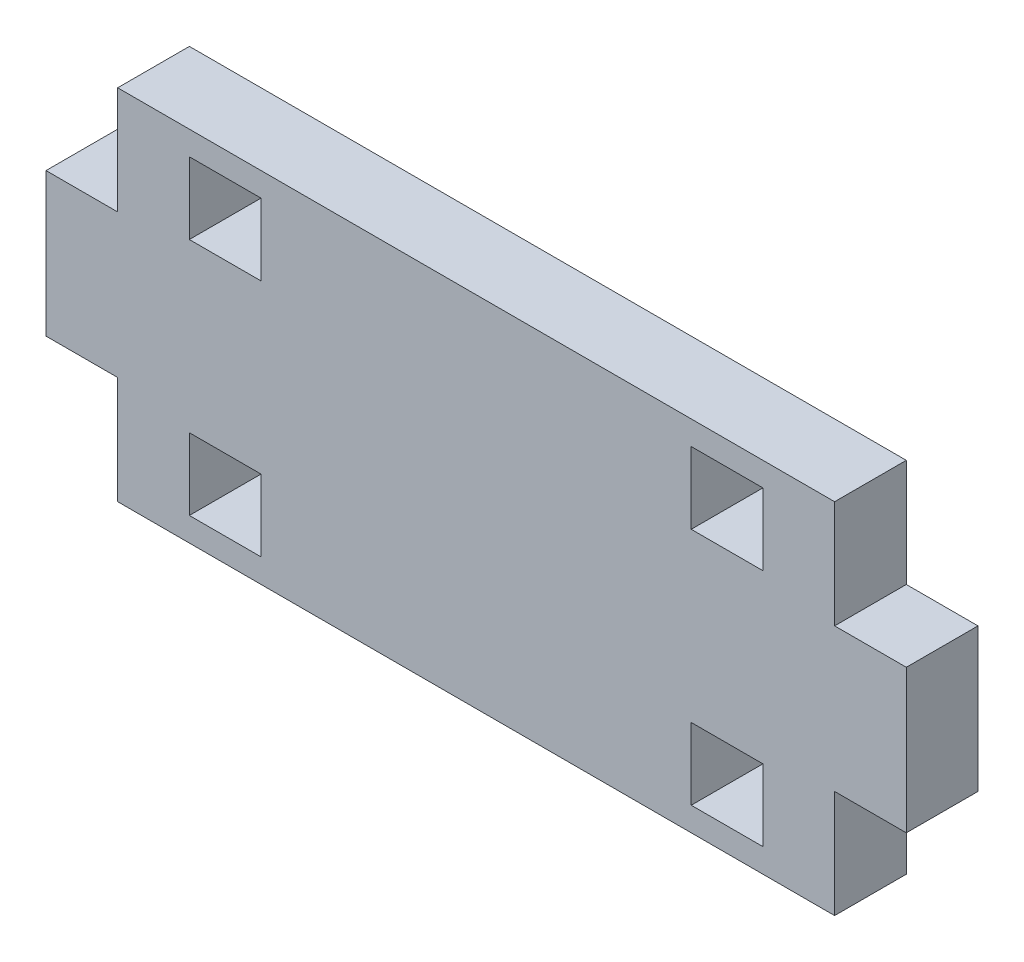
ISO-10303-21;
HEADER;
FILE_DESCRIPTION(('STEP AP214'),'2;1');
FILE_NAME('part.step','',(''),(''),'','','');
FILE_SCHEMA(('AUTOMOTIVE_DESIGN { 1 0 10303 214 1 1 1 1 }'));
ENDSEC;
DATA;
#1=APPLICATION_CONTEXT('core data for automotive mechanical design processes');
#2=APPLICATION_PROTOCOL_DEFINITION('international standard','automotive_design',2000,#1);
#3=PRODUCT_CONTEXT('',#1,'mechanical');
#4=PRODUCT('Part','Part','',(#3));
#5=PRODUCT_RELATED_PRODUCT_CATEGORY('part','',(#4));
#6=PRODUCT_DEFINITION_FORMATION('','',#4);
#7=PRODUCT_DEFINITION_CONTEXT('part definition',#1,'design');
#8=PRODUCT_DEFINITION('design','',#6,#7);
#9=PRODUCT_DEFINITION_SHAPE('','',#8);
#10=(LENGTH_UNIT() NAMED_UNIT(*) SI_UNIT(.MILLI.,.METRE.));
#11=(NAMED_UNIT(*) PLANE_ANGLE_UNIT() SI_UNIT($,.RADIAN.));
#12=(NAMED_UNIT(*) SI_UNIT($,.STERADIAN.) SOLID_ANGLE_UNIT());
#13=UNCERTAINTY_MEASURE_WITH_UNIT(LENGTH_MEASURE(1.E-05),#10,'distance_accuracy_value','');
#14=(GEOMETRIC_REPRESENTATION_CONTEXT(3) GLOBAL_UNCERTAINTY_ASSIGNED_CONTEXT((#13)) GLOBAL_UNIT_ASSIGNED_CONTEXT((#10,
#11,#12)) REPRESENTATION_CONTEXT('',''));
#15=CARTESIAN_POINT('',(0.,0.,0.));
#16=DIRECTION('',(0.,0.,1.));
#17=DIRECTION('',(1.,0.,0.));
#18=AXIS2_PLACEMENT_3D('',#15,#16,#17);
#19=CARTESIAN_POINT('',(0.,0.,3.));
#20=DIRECTION('',(0.,0.,1.));
#21=DIRECTION('',(1.,0.,0.));
#22=AXIS2_PLACEMENT_3D('',#19,#20,#21);
#23=PLANE('',#22);
#24=DIRECTION('',(0.,-1.,0.));
#25=VECTOR('',#24,1.);
#26=CARTESIAN_POINT('',(-16.,3.4986125801518,3.));
#27=LINE('',#26,#25);
#28=CARTESIAN_POINT('',(-16.,3.4986125801518,3.));
#29=VERTEX_POINT('',#28);
#30=CARTESIAN_POINT('',(-16.,-2.5013874198482,3.));
#31=VERTEX_POINT('',#30);
#32=EDGE_CURVE('E347',#29,#31,#27,.T.);
#33=ORIENTED_EDGE('',*,*,#32,.T.);
#34=DIRECTION('',(1.,0.,0.));
#35=VECTOR('',#34,1.);
#36=CARTESIAN_POINT('',(-16.,-2.5013874198482,3.));
#37=LINE('',#36,#35);
#38=CARTESIAN_POINT('',(-13.,-2.5013874198482,3.));
#39=VERTEX_POINT('',#38);
#40=EDGE_CURVE('E350',#31,#39,#37,.T.);
#41=ORIENTED_EDGE('',*,*,#40,.T.);
#42=DIRECTION('',(0.,-1.,0.));
#43=VECTOR('',#42,1.);
#44=CARTESIAN_POINT('',(-13.,-2.5013874198482,3.));
#45=LINE('',#44,#43);
#46=CARTESIAN_POINT('',(-13.,-7.0013874198482,3.));
#47=VERTEX_POINT('',#46);
#48=EDGE_CURVE('E353',#39,#47,#45,.T.);
#49=ORIENTED_EDGE('',*,*,#48,.T.);
#50=DIRECTION('',(1.,0.,0.));
#51=VECTOR('',#50,1.);
#52=CARTESIAN_POINT('',(-13.,-7.0013874198482,3.));
#53=LINE('',#52,#51);
#54=CARTESIAN_POINT('',(17.,-7.0013874198482,3.));
#55=VERTEX_POINT('',#54);
#56=EDGE_CURVE('E355',#47,#55,#53,.T.);
#57=ORIENTED_EDGE('',*,*,#56,.T.);
#58=DIRECTION('',(0.,1.,0.));
#59=VECTOR('',#58,1.);
#60=CARTESIAN_POINT('',(17.,-2.5013874198482,3.));
#61=LINE('',#60,#59);
#62=CARTESIAN_POINT('',(17.,-2.5013874198482,3.));
#63=VERTEX_POINT('',#62);
#64=EDGE_CURVE('E357',#55,#63,#61,.T.);
#65=ORIENTED_EDGE('',*,*,#64,.T.);
#66=DIRECTION('',(1.,0.,0.));
#67=VECTOR('',#66,1.);
#68=CARTESIAN_POINT('',(20.,-2.5013874198482,3.));
#69=LINE('',#68,#67);
#70=CARTESIAN_POINT('',(20.,-2.5013874198482,3.));
#71=VERTEX_POINT('',#70);
#72=EDGE_CURVE('E359',#63,#71,#69,.T.);
#73=ORIENTED_EDGE('',*,*,#72,.T.);
#74=DIRECTION('',(0.,1.,0.));
#75=VECTOR('',#74,1.);
#76=CARTESIAN_POINT('',(20.,3.4986125801518,3.));
#77=LINE('',#76,#75);
#78=CARTESIAN_POINT('',(20.,3.4986125801518,3.));
#79=VERTEX_POINT('',#78);
#80=EDGE_CURVE('E361',#71,#79,#77,.T.);
#81=ORIENTED_EDGE('',*,*,#80,.T.);
#82=DIRECTION('',(-1.,0.,0.));
#83=VECTOR('',#82,1.);
#84=CARTESIAN_POINT('',(17.,3.4986125801518,3.));
#85=LINE('',#84,#83);
#86=CARTESIAN_POINT('',(17.,3.4986125801518,3.));
#87=VERTEX_POINT('',#86);
#88=EDGE_CURVE('E363',#79,#87,#85,.T.);
#89=ORIENTED_EDGE('',*,*,#88,.T.);
#90=DIRECTION('',(0.,1.,0.));
#91=VECTOR('',#90,1.);
#92=CARTESIAN_POINT('',(17.,7.9986125801518,3.));
#93=LINE('',#92,#91);
#94=CARTESIAN_POINT('',(17.,7.9986125801518,3.));
#95=VERTEX_POINT('',#94);
#96=EDGE_CURVE('E365',#87,#95,#93,.T.);
#97=ORIENTED_EDGE('',*,*,#96,.T.);
#98=DIRECTION('',(-1.,0.,0.));
#99=VECTOR('',#98,1.);
#100=CARTESIAN_POINT('',(-13.,7.9986125801518,3.));
#101=LINE('',#100,#99);
#102=CARTESIAN_POINT('',(-13.,7.9986125801518,3.));
#103=VERTEX_POINT('',#102);
#104=EDGE_CURVE('E367',#95,#103,#101,.T.);
#105=ORIENTED_EDGE('',*,*,#104,.T.);
#106=DIRECTION('',(0.,-1.,0.));
#107=VECTOR('',#106,1.);
#108=CARTESIAN_POINT('',(-13.,3.4986125801518,3.));
#109=LINE('',#108,#107);
#110=CARTESIAN_POINT('',(-13.,3.4986125801518,3.));
#111=VERTEX_POINT('',#110);
#112=EDGE_CURVE('E369',#103,#111,#109,.T.);
#113=ORIENTED_EDGE('',*,*,#112,.T.);
#114=DIRECTION('',(-1.,0.,0.));
#115=VECTOR('',#114,1.);
#116=CARTESIAN_POINT('',(-16.,3.4986125801518,3.));
#117=LINE('',#116,#115);
#118=EDGE_CURVE('E371',#111,#29,#117,.T.);
#119=ORIENTED_EDGE('',*,*,#118,.T.);
#120=EDGE_LOOP('',(#33,#41,#49,#57,#65,#73,#81,#89,#97,#105,#113,#119));
#121=FACE_BOUND('',#120,.T.);
#122=DIRECTION('',(0.,-1.,0.));
#123=VECTOR('',#122,1.);
#124=CARTESIAN_POINT('',(-10.0020364860879,6.9986125801518,3.));
#125=LINE('',#124,#123);
#126=CARTESIAN_POINT('',(-10.0020364860879,6.9986125801518,3.));
#127=VERTEX_POINT('',#126);
#128=CARTESIAN_POINT('',(-10.0020364860879,3.9986125801518,3.));
#129=VERTEX_POINT('',#128);
#130=EDGE_CURVE('E318',#127,#129,#125,.T.);
#131=ORIENTED_EDGE('',*,*,#130,.F.);
#132=DIRECTION('',(-1.,0.,0.));
#133=VECTOR('',#132,1.);
#134=CARTESIAN_POINT('',(-10.0020364860879,6.9986125801518,3.));
#135=LINE('',#134,#133);
#136=CARTESIAN_POINT('',(-7.00203648608795,6.9986125801518,3.));
#137=VERTEX_POINT('',#136);
#138=EDGE_CURVE('E316',#137,#127,#135,.T.);
#139=ORIENTED_EDGE('',*,*,#138,.F.);
#140=DIRECTION('',(0.,1.,0.));
#141=VECTOR('',#140,1.);
#142=CARTESIAN_POINT('',(-7.00203648608795,6.9986125801518,3.));
#143=LINE('',#142,#141);
#144=CARTESIAN_POINT('',(-7.00203648608795,3.9986125801518,3.));
#145=VERTEX_POINT('',#144);
#146=EDGE_CURVE('E324',#145,#137,#143,.T.);
#147=ORIENTED_EDGE('',*,*,#146,.F.);
#148=DIRECTION('',(1.,0.,0.));
#149=VECTOR('',#148,1.);
#150=CARTESIAN_POINT('',(-10.0020364860879,3.9986125801518,3.));
#151=LINE('',#150,#149);
#152=EDGE_CURVE('E321',#129,#145,#151,.T.);
#153=ORIENTED_EDGE('',*,*,#152,.F.);
#154=EDGE_LOOP('',(#131,#139,#147,#153));
#155=FACE_BOUND('',#154,.T.);
#156=DIRECTION('',(0.,-1.,0.));
#157=VECTOR('',#156,1.);
#158=CARTESIAN_POINT('',(-10.0020364860879,-3.0013874198482,3.));
#159=LINE('',#158,#157);
#160=CARTESIAN_POINT('',(-10.0020364860879,-3.0013874198482,3.));
#161=VERTEX_POINT('',#160);
#162=CARTESIAN_POINT('',(-10.0020364860879,-6.0013874198482,3.));
#163=VERTEX_POINT('',#162);
#164=EDGE_CURVE('E287',#161,#163,#159,.T.);
#165=ORIENTED_EDGE('',*,*,#164,.F.);
#166=DIRECTION('',(-1.,0.,0.));
#167=VECTOR('',#166,1.);
#168=CARTESIAN_POINT('',(-10.0020364860879,-3.0013874198482,3.));
#169=LINE('',#168,#167);
#170=CARTESIAN_POINT('',(-7.00203648608794,-3.0013874198482,3.));
#171=VERTEX_POINT('',#170);
#172=EDGE_CURVE('E285',#171,#161,#169,.T.);
#173=ORIENTED_EDGE('',*,*,#172,.F.);
#174=DIRECTION('',(0.,1.,0.));
#175=VECTOR('',#174,1.);
#176=CARTESIAN_POINT('',(-7.00203648608794,-3.0013874198482,3.));
#177=LINE('',#176,#175);
#178=CARTESIAN_POINT('',(-7.00203648608794,-6.0013874198482,3.));
#179=VERTEX_POINT('',#178);
#180=EDGE_CURVE('E293',#179,#171,#177,.T.);
#181=ORIENTED_EDGE('',*,*,#180,.F.);
#182=DIRECTION('',(1.,0.,0.));
#183=VECTOR('',#182,1.);
#184=CARTESIAN_POINT('',(-10.0020364860879,-6.0013874198482,3.));
#185=LINE('',#184,#183);
#186=EDGE_CURVE('E290',#163,#179,#185,.T.);
#187=ORIENTED_EDGE('',*,*,#186,.F.);
#188=EDGE_LOOP('',(#165,#173,#181,#187));
#189=FACE_BOUND('',#188,.T.);
#190=DIRECTION('',(0.,-1.,0.));
#191=VECTOR('',#190,1.);
#192=CARTESIAN_POINT('',(11.,6.9986125801518,3.));
#193=LINE('',#192,#191);
#194=CARTESIAN_POINT('',(11.,6.9986125801518,3.));
#195=VERTEX_POINT('',#194);
#196=CARTESIAN_POINT('',(11.,3.9986125801518,3.));
#197=VERTEX_POINT('',#196);
#198=EDGE_CURVE('E256',#195,#197,#193,.T.);
#199=ORIENTED_EDGE('',*,*,#198,.F.);
#200=DIRECTION('',(-1.,0.,0.));
#201=VECTOR('',#200,1.);
#202=CARTESIAN_POINT('',(14.,6.9986125801518,3.));
#203=LINE('',#202,#201);
#204=CARTESIAN_POINT('',(14.,6.9986125801518,3.));
#205=VERTEX_POINT('',#204);
#206=EDGE_CURVE('E254',#205,#195,#203,.T.);
#207=ORIENTED_EDGE('',*,*,#206,.F.);
#208=DIRECTION('',(0.,1.,0.));
#209=VECTOR('',#208,1.);
#210=CARTESIAN_POINT('',(14.,6.9986125801518,3.));
#211=LINE('',#210,#209);
#212=CARTESIAN_POINT('',(14.,3.9986125801518,3.));
#213=VERTEX_POINT('',#212);
#214=EDGE_CURVE('E262',#213,#205,#211,.T.);
#215=ORIENTED_EDGE('',*,*,#214,.F.);
#216=DIRECTION('',(1.,0.,0.));
#217=VECTOR('',#216,1.);
#218=CARTESIAN_POINT('',(14.,3.9986125801518,3.));
#219=LINE('',#218,#217);
#220=EDGE_CURVE('E259',#197,#213,#219,.T.);
#221=ORIENTED_EDGE('',*,*,#220,.F.);
#222=EDGE_LOOP('',(#199,#207,#215,#221));
#223=FACE_BOUND('',#222,.T.);
#224=DIRECTION('',(0.,1.,0.));
#225=VECTOR('',#224,1.);
#226=CARTESIAN_POINT('',(14.,-6.0013874198482,3.));
#227=LINE('',#226,#225);
#228=CARTESIAN_POINT('',(14.,-6.0013874198482,3.));
#229=VERTEX_POINT('',#228);
#230=CARTESIAN_POINT('',(14.,-3.00138741984819,3.));
#231=VERTEX_POINT('',#230);
#232=EDGE_CURVE('E226',#229,#231,#227,.T.);
#233=ORIENTED_EDGE('',*,*,#232,.F.);
#234=DIRECTION('',(1.,0.,0.));
#235=VECTOR('',#234,1.);
#236=CARTESIAN_POINT('',(14.,-6.0013874198482,3.));
#237=LINE('',#236,#235);
#238=CARTESIAN_POINT('',(11.,-6.0013874198482,3.));
#239=VERTEX_POINT('',#238);
#240=EDGE_CURVE('E218',#239,#229,#237,.T.);
#241=ORIENTED_EDGE('',*,*,#240,.F.);
#242=DIRECTION('',(0.,-1.,0.));
#243=VECTOR('',#242,1.);
#244=CARTESIAN_POINT('',(11.,-6.0013874198482,3.));
#245=LINE('',#244,#243);
#246=CARTESIAN_POINT('',(11.,-3.0013874198482,3.));
#247=VERTEX_POINT('',#246);
#248=EDGE_CURVE('E240',#247,#239,#245,.T.);
#249=ORIENTED_EDGE('',*,*,#248,.F.);
#250=DIRECTION('',(-1.,0.,0.));
#251=VECTOR('',#250,1.);
#252=CARTESIAN_POINT('',(14.,-3.00138741984819,3.));
#253=LINE('',#252,#251);
#254=EDGE_CURVE('E238',#231,#247,#253,.T.);
#255=ORIENTED_EDGE('',*,*,#254,.F.);
#256=EDGE_LOOP('',(#233,#241,#249,#255));
#257=FACE_BOUND('',#256,.T.);
#258=ADVANCED_FACE('F33',(#121,#155,#189,#223,#257),#23,.T.);
#259=CARTESIAN_POINT('',(0.,0.,0.));
#260=DIRECTION('',(0.,0.,1.));
#261=DIRECTION('',(1.,0.,0.));
#262=AXIS2_PLACEMENT_3D('',#259,#260,#261);
#263=PLANE('',#262);
#264=DIRECTION('',(-1.,0.,0.));
#265=VECTOR('',#264,1.);
#266=CARTESIAN_POINT('',(14.,6.9986125801518,0.));
#267=LINE('',#266,#265);
#268=CARTESIAN_POINT('',(14.,6.9986125801518,0.));
#269=VERTEX_POINT('',#268);
#270=CARTESIAN_POINT('',(11.,6.9986125801518,0.));
#271=VERTEX_POINT('',#270);
#272=EDGE_CURVE('E234',#269,#271,#267,.T.);
#273=ORIENTED_EDGE('',*,*,#272,.T.);
#274=DIRECTION('',(0.,-1.,0.));
#275=VECTOR('',#274,1.);
#276=CARTESIAN_POINT('',(11.,6.9986125801518,0.));
#277=LINE('',#276,#275);
#278=CARTESIAN_POINT('',(11.,3.9986125801518,0.));
#279=VERTEX_POINT('',#278);
#280=EDGE_CURVE('E267',#271,#279,#277,.T.);
#281=ORIENTED_EDGE('',*,*,#280,.T.);
#282=DIRECTION('',(1.,0.,0.));
#283=VECTOR('',#282,1.);
#284=CARTESIAN_POINT('',(14.,3.9986125801518,0.));
#285=LINE('',#284,#283);
#286=CARTESIAN_POINT('',(14.,3.9986125801518,0.));
#287=VERTEX_POINT('',#286);
#288=EDGE_CURVE('E270',#279,#287,#285,.T.);
#289=ORIENTED_EDGE('',*,*,#288,.T.);
#290=DIRECTION('',(0.,1.,0.));
#291=VECTOR('',#290,1.);
#292=CARTESIAN_POINT('',(14.,6.9986125801518,0.));
#293=LINE('',#292,#291);
#294=EDGE_CURVE('E257',#287,#269,#293,.T.);
#295=ORIENTED_EDGE('',*,*,#294,.T.);
#296=EDGE_LOOP('',(#273,#281,#289,#295));
#297=FACE_BOUND('',#296,.T.);
#298=DIRECTION('',(-1.,0.,0.));
#299=VECTOR('',#298,1.);
#300=CARTESIAN_POINT('',(-10.0020364860879,6.9986125801518,0.));
#301=LINE('',#300,#299);
#302=CARTESIAN_POINT('',(-7.00203648608795,6.9986125801518,0.));
#303=VERTEX_POINT('',#302);
#304=CARTESIAN_POINT('',(-10.0020364860879,6.9986125801518,0.));
#305=VERTEX_POINT('',#304);
#306=EDGE_CURVE('E315',#303,#305,#301,.T.);
#307=ORIENTED_EDGE('',*,*,#306,.T.);
#308=DIRECTION('',(0.,-1.,0.));
#309=VECTOR('',#308,1.);
#310=CARTESIAN_POINT('',(-10.0020364860879,6.9986125801518,0.));
#311=LINE('',#310,#309);
#312=CARTESIAN_POINT('',(-10.0020364860879,3.9986125801518,0.));
#313=VERTEX_POINT('',#312);
#314=EDGE_CURVE('E329',#305,#313,#311,.T.);
#315=ORIENTED_EDGE('',*,*,#314,.T.);
#316=DIRECTION('',(1.,0.,0.));
#317=VECTOR('',#316,1.);
#318=CARTESIAN_POINT('',(-10.0020364860879,3.9986125801518,0.));
#319=LINE('',#318,#317);
#320=CARTESIAN_POINT('',(-7.00203648608795,3.9986125801518,0.));
#321=VERTEX_POINT('',#320);
#322=EDGE_CURVE('E332',#313,#321,#319,.T.);
#323=ORIENTED_EDGE('',*,*,#322,.T.);
#324=DIRECTION('',(0.,1.,0.));
#325=VECTOR('',#324,1.);
#326=CARTESIAN_POINT('',(-7.00203648608795,6.9986125801518,0.));
#327=LINE('',#326,#325);
#328=EDGE_CURVE('E319',#321,#303,#327,.T.);
#329=ORIENTED_EDGE('',*,*,#328,.T.);
#330=EDGE_LOOP('',(#307,#315,#323,#329));
#331=FACE_BOUND('',#330,.T.);
#332=DIRECTION('',(0.,-1.,0.));
#333=VECTOR('',#332,1.);
#334=CARTESIAN_POINT('',(-16.,3.4986125801518,0.));
#335=LINE('',#334,#333);
#336=CARTESIAN_POINT('',(-16.,3.4986125801518,0.));
#337=VERTEX_POINT('',#336);
#338=CARTESIAN_POINT('',(-16.,-2.5013874198482,0.));
#339=VERTEX_POINT('',#338);
#340=EDGE_CURVE('E346',#337,#339,#335,.T.);
#341=ORIENTED_EDGE('',*,*,#340,.F.);
#342=DIRECTION('',(-1.,0.,0.));
#343=VECTOR('',#342,1.);
#344=CARTESIAN_POINT('',(-16.,3.4986125801518,0.));
#345=LINE('',#344,#343);
#346=CARTESIAN_POINT('',(-13.,3.4986125801518,0.));
#347=VERTEX_POINT('',#346);
#348=EDGE_CURVE('E351',#347,#337,#345,.T.);
#349=ORIENTED_EDGE('',*,*,#348,.F.);
#350=DIRECTION('',(0.,-1.,0.));
#351=VECTOR('',#350,1.);
#352=CARTESIAN_POINT('',(-13.,3.4986125801518,0.));
#353=LINE('',#352,#351);
#354=CARTESIAN_POINT('',(-13.,7.9986125801518,0.));
#355=VERTEX_POINT('',#354);
#356=EDGE_CURVE('E394',#355,#347,#353,.T.);
#357=ORIENTED_EDGE('',*,*,#356,.F.);
#358=DIRECTION('',(-1.,0.,0.));
#359=VECTOR('',#358,1.);
#360=CARTESIAN_POINT('',(-13.,7.9986125801518,0.));
#361=LINE('',#360,#359);
#362=CARTESIAN_POINT('',(17.,7.9986125801518,0.));
#363=VERTEX_POINT('',#362);
#364=EDGE_CURVE('E392',#363,#355,#361,.T.);
#365=ORIENTED_EDGE('',*,*,#364,.F.);
#366=DIRECTION('',(0.,1.,0.));
#367=VECTOR('',#366,1.);
#368=CARTESIAN_POINT('',(17.,7.9986125801518,0.));
#369=LINE('',#368,#367);
#370=CARTESIAN_POINT('',(17.,3.4986125801518,0.));
#371=VERTEX_POINT('',#370);
#372=EDGE_CURVE('E390',#371,#363,#369,.T.);
#373=ORIENTED_EDGE('',*,*,#372,.F.);
#374=DIRECTION('',(-1.,0.,0.));
#375=VECTOR('',#374,1.);
#376=CARTESIAN_POINT('',(17.,3.4986125801518,0.));
#377=LINE('',#376,#375);
#378=CARTESIAN_POINT('',(20.,3.4986125801518,0.));
#379=VERTEX_POINT('',#378);
#380=EDGE_CURVE('E388',#379,#371,#377,.T.);
#381=ORIENTED_EDGE('',*,*,#380,.F.);
#382=DIRECTION('',(0.,1.,0.));
#383=VECTOR('',#382,1.);
#384=CARTESIAN_POINT('',(20.,3.4986125801518,0.));
#385=LINE('',#384,#383);
#386=CARTESIAN_POINT('',(20.,-2.5013874198482,0.));
#387=VERTEX_POINT('',#386);
#388=EDGE_CURVE('E386',#387,#379,#385,.T.);
#389=ORIENTED_EDGE('',*,*,#388,.F.);
#390=DIRECTION('',(1.,0.,0.));
#391=VECTOR('',#390,1.);
#392=CARTESIAN_POINT('',(20.,-2.5013874198482,0.));
#393=LINE('',#392,#391);
#394=CARTESIAN_POINT('',(17.,-2.5013874198482,0.));
#395=VERTEX_POINT('',#394);
#396=EDGE_CURVE('E384',#395,#387,#393,.T.);
#397=ORIENTED_EDGE('',*,*,#396,.F.);
#398=DIRECTION('',(0.,1.,0.));
#399=VECTOR('',#398,1.);
#400=CARTESIAN_POINT('',(17.,-2.5013874198482,0.));
#401=LINE('',#400,#399);
#402=CARTESIAN_POINT('',(17.,-7.0013874198482,0.));
#403=VERTEX_POINT('',#402);
#404=EDGE_CURVE('E382',#403,#395,#401,.T.);
#405=ORIENTED_EDGE('',*,*,#404,.F.);
#406=DIRECTION('',(1.,0.,0.));
#407=VECTOR('',#406,1.);
#408=CARTESIAN_POINT('',(-13.,-7.0013874198482,0.));
#409=LINE('',#408,#407);
#410=CARTESIAN_POINT('',(-13.,-7.0013874198482,0.));
#411=VERTEX_POINT('',#410);
#412=EDGE_CURVE('E380',#411,#403,#409,.T.);
#413=ORIENTED_EDGE('',*,*,#412,.F.);
#414=DIRECTION('',(0.,-1.,0.));
#415=VECTOR('',#414,1.);
#416=CARTESIAN_POINT('',(-13.,-2.5013874198482,0.));
#417=LINE('',#416,#415);
#418=CARTESIAN_POINT('',(-13.,-2.5013874198482,0.));
#419=VERTEX_POINT('',#418);
#420=EDGE_CURVE('E378',#419,#411,#417,.T.);
#421=ORIENTED_EDGE('',*,*,#420,.F.);
#422=DIRECTION('',(1.,0.,0.));
#423=VECTOR('',#422,1.);
#424=CARTESIAN_POINT('',(-16.,-2.5013874198482,0.));
#425=LINE('',#424,#423);
#426=EDGE_CURVE('E376',#339,#419,#425,.T.);
#427=ORIENTED_EDGE('',*,*,#426,.F.);
#428=EDGE_LOOP('',(#341,#349,#357,#365,#373,#381,#389,#397,#405,#413,#421,#427));
#429=FACE_BOUND('',#428,.T.);
#430=DIRECTION('',(-1.,0.,0.));
#431=VECTOR('',#430,1.);
#432=CARTESIAN_POINT('',(-10.0020364860879,-3.0013874198482,0.));
#433=LINE('',#432,#431);
#434=CARTESIAN_POINT('',(-7.00203648608794,-3.0013874198482,0.));
#435=VERTEX_POINT('',#434);
#436=CARTESIAN_POINT('',(-10.0020364860879,-3.0013874198482,0.));
#437=VERTEX_POINT('',#436);
#438=EDGE_CURVE('E284',#435,#437,#433,.T.);
#439=ORIENTED_EDGE('',*,*,#438,.T.);
#440=DIRECTION('',(0.,-1.,0.));
#441=VECTOR('',#440,1.);
#442=CARTESIAN_POINT('',(-10.0020364860879,-3.0013874198482,0.));
#443=LINE('',#442,#441);
#444=CARTESIAN_POINT('',(-10.0020364860879,-6.0013874198482,0.));
#445=VERTEX_POINT('',#444);
#446=EDGE_CURVE('E298',#437,#445,#443,.T.);
#447=ORIENTED_EDGE('',*,*,#446,.T.);
#448=DIRECTION('',(1.,0.,0.));
#449=VECTOR('',#448,1.);
#450=CARTESIAN_POINT('',(-10.0020364860879,-6.0013874198482,0.));
#451=LINE('',#450,#449);
#452=CARTESIAN_POINT('',(-7.00203648608794,-6.0013874198482,0.));
#453=VERTEX_POINT('',#452);
#454=EDGE_CURVE('E301',#445,#453,#451,.T.);
#455=ORIENTED_EDGE('',*,*,#454,.T.);
#456=DIRECTION('',(0.,1.,0.));
#457=VECTOR('',#456,1.);
#458=CARTESIAN_POINT('',(-7.00203648608794,-3.0013874198482,0.));
#459=LINE('',#458,#457);
#460=EDGE_CURVE('E288',#453,#435,#459,.T.);
#461=ORIENTED_EDGE('',*,*,#460,.T.);
#462=EDGE_LOOP('',(#439,#447,#455,#461));
#463=FACE_BOUND('',#462,.T.);
#464=DIRECTION('',(1.,0.,0.));
#465=VECTOR('',#464,1.);
#466=CARTESIAN_POINT('',(14.,-6.0013874198482,0.));
#467=LINE('',#466,#465);
#468=CARTESIAN_POINT('',(11.,-6.0013874198482,0.));
#469=VERTEX_POINT('',#468);
#470=CARTESIAN_POINT('',(14.,-6.0013874198482,0.));
#471=VERTEX_POINT('',#470);
#472=EDGE_CURVE('E56',#469,#471,#467,.T.);
#473=ORIENTED_EDGE('',*,*,#472,.T.);
#474=DIRECTION('',(0.,1.,0.));
#475=VECTOR('',#474,1.);
#476=CARTESIAN_POINT('',(14.,-6.0013874198482,0.));
#477=LINE('',#476,#475);
#478=CARTESIAN_POINT('',(14.,-3.00138741984819,0.));
#479=VERTEX_POINT('',#478);
#480=EDGE_CURVE('E233',#471,#479,#477,.T.);
#481=ORIENTED_EDGE('',*,*,#480,.T.);
#482=DIRECTION('',(-1.,0.,0.));
#483=VECTOR('',#482,1.);
#484=CARTESIAN_POINT('',(14.,-3.00138741984819,0.));
#485=LINE('',#484,#483);
#486=CARTESIAN_POINT('',(11.,-3.0013874198482,0.));
#487=VERTEX_POINT('',#486);
#488=EDGE_CURVE('E246',#479,#487,#485,.T.);
#489=ORIENTED_EDGE('',*,*,#488,.T.);
#490=DIRECTION('',(0.,-1.,0.));
#491=VECTOR('',#490,1.);
#492=CARTESIAN_POINT('',(11.,-6.0013874198482,0.));
#493=LINE('',#492,#491);
#494=EDGE_CURVE('E227',#487,#469,#493,.T.);
#495=ORIENTED_EDGE('',*,*,#494,.T.);
#496=EDGE_LOOP('',(#473,#481,#489,#495));
#497=FACE_BOUND('',#496,.T.);
#498=ADVANCED_FACE('F436',(#297,#331,#429,#463,#497),#263,.F.);
#499=CARTESIAN_POINT('',(-16.,3.4986125801518,3.));
#500=DIRECTION('',(1.,0.,0.));
#501=DIRECTION('',(0.,0.,-1.));
#502=AXIS2_PLACEMENT_3D('',#499,#500,#501);
#503=PLANE('',#502);
#504=ORIENTED_EDGE('',*,*,#340,.T.);
#505=DIRECTION('',(0.,0.,-1.));
#506=VECTOR('',#505,1.);
#507=CARTESIAN_POINT('',(-16.,-2.5013874198482,3.));
#508=LINE('',#507,#506);
#509=EDGE_CURVE('E11',#31,#339,#508,.T.);
#510=ORIENTED_EDGE('',*,*,#509,.F.);
#511=ORIENTED_EDGE('',*,*,#32,.F.);
#512=DIRECTION('',(0.,0.,-1.));
#513=VECTOR('',#512,1.);
#514=CARTESIAN_POINT('',(-16.,3.4986125801518,3.));
#515=LINE('',#514,#513);
#516=EDGE_CURVE('E373',#29,#337,#515,.T.);
#517=ORIENTED_EDGE('',*,*,#516,.T.);
#518=EDGE_LOOP('',(#504,#510,#511,#517));
#519=FACE_BOUND('',#518,.T.);
#520=ADVANCED_FACE('F35',(#519),#503,.F.);
#521=CARTESIAN_POINT('',(-16.,-2.5013874198482,3.));
#522=DIRECTION('',(0.,1.,0.));
#523=DIRECTION('',(0.,0.,1.));
#524=AXIS2_PLACEMENT_3D('',#521,#522,#523);
#525=PLANE('',#524);
#526=ORIENTED_EDGE('',*,*,#426,.T.);
#527=DIRECTION('',(0.,0.,-1.));
#528=VECTOR('',#527,1.);
#529=CARTESIAN_POINT('',(-13.,-2.5013874198482,3.));
#530=LINE('',#529,#528);
#531=EDGE_CURVE('E41',#39,#419,#530,.T.);
#532=ORIENTED_EDGE('',*,*,#531,.F.);
#533=ORIENTED_EDGE('',*,*,#40,.F.);
#534=ORIENTED_EDGE('',*,*,#509,.T.);
#535=EDGE_LOOP('',(#526,#532,#533,#534));
#536=FACE_BOUND('',#535,.T.);
#537=ADVANCED_FACE('F454',(#536),#525,.F.);
#538=CARTESIAN_POINT('',(-13.,-2.5013874198482,3.));
#539=DIRECTION('',(1.,0.,0.));
#540=DIRECTION('',(0.,1.,0.));
#541=AXIS2_PLACEMENT_3D('',#538,#539,#540);
#542=PLANE('',#541);
#543=ORIENTED_EDGE('',*,*,#420,.T.);
#544=DIRECTION('',(0.,0.,-1.));
#545=VECTOR('',#544,1.);
#546=CARTESIAN_POINT('',(-13.,-7.0013874198482,3.));
#547=LINE('',#546,#545);
#548=EDGE_CURVE('E423',#47,#411,#547,.T.);
#549=ORIENTED_EDGE('',*,*,#548,.F.);
#550=ORIENTED_EDGE('',*,*,#48,.F.);
#551=ORIENTED_EDGE('',*,*,#531,.T.);
#552=EDGE_LOOP('',(#543,#549,#550,#551));
#553=FACE_BOUND('',#552,.T.);
#554=ADVANCED_FACE('F430',(#553),#542,.F.);
#555=CARTESIAN_POINT('',(-13.,-7.0013874198482,3.));
#556=DIRECTION('',(0.,1.,0.));
#557=DIRECTION('',(-1.,0.,0.));
#558=AXIS2_PLACEMENT_3D('',#555,#556,#557);
#559=PLANE('',#558);
#560=ORIENTED_EDGE('',*,*,#412,.T.);
#561=DIRECTION('',(0.,0.,-1.));
#562=VECTOR('',#561,1.);
#563=CARTESIAN_POINT('',(17.,-7.0013874198482,3.));
#564=LINE('',#563,#562);
#565=EDGE_CURVE('E420',#55,#403,#564,.T.);
#566=ORIENTED_EDGE('',*,*,#565,.F.);
#567=ORIENTED_EDGE('',*,*,#56,.F.);
#568=ORIENTED_EDGE('',*,*,#548,.T.);
#569=EDGE_LOOP('',(#560,#566,#567,#568));
#570=FACE_BOUND('',#569,.T.);
#571=ADVANCED_FACE('F442',(#570),#559,.F.);
#572=CARTESIAN_POINT('',(17.,-2.5013874198482,3.));
#573=DIRECTION('',(-1.,0.,0.));
#574=DIRECTION('',(0.,-1.,0.));
#575=AXIS2_PLACEMENT_3D('',#572,#573,#574);
#576=PLANE('',#575);
#577=ORIENTED_EDGE('',*,*,#404,.T.);
#578=DIRECTION('',(0.,0.,-1.));
#579=VECTOR('',#578,1.);
#580=CARTESIAN_POINT('',(17.,-2.5013874198482,3.));
#581=LINE('',#580,#579);
#582=EDGE_CURVE('E417',#63,#395,#581,.T.);
#583=ORIENTED_EDGE('',*,*,#582,.F.);
#584=ORIENTED_EDGE('',*,*,#64,.F.);
#585=ORIENTED_EDGE('',*,*,#565,.T.);
#586=EDGE_LOOP('',(#577,#583,#584,#585));
#587=FACE_BOUND('',#586,.T.);
#588=ADVANCED_FACE('F446',(#587),#576,.F.);
#589=CARTESIAN_POINT('',(20.,-2.5013874198482,3.));
#590=DIRECTION('',(0.,1.,0.));
#591=DIRECTION('',(-1.,0.,0.));
#592=AXIS2_PLACEMENT_3D('',#589,#590,#591);
#593=PLANE('',#592);
#594=ORIENTED_EDGE('',*,*,#396,.T.);
#595=DIRECTION('',(0.,0.,-1.));
#596=VECTOR('',#595,1.);
#597=CARTESIAN_POINT('',(20.,-2.5013874198482,3.));
#598=LINE('',#597,#596);
#599=EDGE_CURVE('E414',#71,#387,#598,.T.);
#600=ORIENTED_EDGE('',*,*,#599,.F.);
#601=ORIENTED_EDGE('',*,*,#72,.F.);
#602=ORIENTED_EDGE('',*,*,#582,.T.);
#603=EDGE_LOOP('',(#594,#600,#601,#602));
#604=FACE_BOUND('',#603,.T.);
#605=ADVANCED_FACE('F487',(#604),#593,.F.);
#606=CARTESIAN_POINT('',(20.,3.4986125801518,3.));
#607=DIRECTION('',(-1.,0.,0.));
#608=DIRECTION('',(0.,0.,1.));
#609=AXIS2_PLACEMENT_3D('',#606,#607,#608);
#610=PLANE('',#609);
#611=ORIENTED_EDGE('',*,*,#388,.T.);
#612=DIRECTION('',(0.,0.,-1.));
#613=VECTOR('',#612,1.);
#614=CARTESIAN_POINT('',(20.,3.4986125801518,3.));
#615=LINE('',#614,#613);
#616=EDGE_CURVE('E411',#79,#379,#615,.T.);
#617=ORIENTED_EDGE('',*,*,#616,.F.);
#618=ORIENTED_EDGE('',*,*,#80,.F.);
#619=ORIENTED_EDGE('',*,*,#599,.T.);
#620=EDGE_LOOP('',(#611,#617,#618,#619));
#621=FACE_BOUND('',#620,.T.);
#622=ADVANCED_FACE('F485',(#621),#610,.F.);
#623=CARTESIAN_POINT('',(17.,3.4986125801518,3.));
#624=DIRECTION('',(0.,-1.,0.));
#625=DIRECTION('',(0.,0.,-1.));
#626=AXIS2_PLACEMENT_3D('',#623,#624,#625);
#627=PLANE('',#626);
#628=ORIENTED_EDGE('',*,*,#380,.T.);
#629=DIRECTION('',(0.,0.,-1.));
#630=VECTOR('',#629,1.);
#631=CARTESIAN_POINT('',(17.,3.4986125801518,3.));
#632=LINE('',#631,#630);
#633=EDGE_CURVE('E408',#87,#371,#632,.T.);
#634=ORIENTED_EDGE('',*,*,#633,.F.);
#635=ORIENTED_EDGE('',*,*,#88,.F.);
#636=ORIENTED_EDGE('',*,*,#616,.T.);
#637=EDGE_LOOP('',(#628,#634,#635,#636));
#638=FACE_BOUND('',#637,.T.);
#639=ADVANCED_FACE('F481',(#638),#627,.F.);
#640=CARTESIAN_POINT('',(17.,7.9986125801518,3.));
#641=DIRECTION('',(-1.,0.,0.));
#642=DIRECTION('',(0.,0.,1.));
#643=AXIS2_PLACEMENT_3D('',#640,#641,#642);
#644=PLANE('',#643);
#645=ORIENTED_EDGE('',*,*,#372,.T.);
#646=DIRECTION('',(0.,0.,-1.));
#647=VECTOR('',#646,1.);
#648=CARTESIAN_POINT('',(17.,7.9986125801518,3.));
#649=LINE('',#648,#647);
#650=EDGE_CURVE('E405',#95,#363,#649,.T.);
#651=ORIENTED_EDGE('',*,*,#650,.F.);
#652=ORIENTED_EDGE('',*,*,#96,.F.);
#653=ORIENTED_EDGE('',*,*,#633,.T.);
#654=EDGE_LOOP('',(#645,#651,#652,#653));
#655=FACE_BOUND('',#654,.T.);
#656=ADVANCED_FACE('F476',(#655),#644,.F.);
#657=CARTESIAN_POINT('',(-13.,7.9986125801518,3.));
#658=DIRECTION('',(0.,-1.,0.));
#659=DIRECTION('',(0.,0.,-1.));
#660=AXIS2_PLACEMENT_3D('',#657,#658,#659);
#661=PLANE('',#660);
#662=ORIENTED_EDGE('',*,*,#364,.T.);
#663=DIRECTION('',(0.,0.,-1.));
#664=VECTOR('',#663,1.);
#665=CARTESIAN_POINT('',(-13.,7.9986125801518,3.));
#666=LINE('',#665,#664);
#667=EDGE_CURVE('E402',#103,#355,#666,.T.);
#668=ORIENTED_EDGE('',*,*,#667,.F.);
#669=ORIENTED_EDGE('',*,*,#104,.F.);
#670=ORIENTED_EDGE('',*,*,#650,.T.);
#671=EDGE_LOOP('',(#662,#668,#669,#670));
#672=FACE_BOUND('',#671,.T.);
#673=ADVANCED_FACE('F470',(#672),#661,.F.);
#674=CARTESIAN_POINT('',(-13.,3.4986125801518,3.));
#675=DIRECTION('',(1.,0.,0.));
#676=DIRECTION('',(0.,1.,0.));
#677=AXIS2_PLACEMENT_3D('',#674,#675,#676);
#678=PLANE('',#677);
#679=ORIENTED_EDGE('',*,*,#356,.T.);
#680=DIRECTION('',(0.,0.,-1.));
#681=VECTOR('',#680,1.);
#682=CARTESIAN_POINT('',(-13.,3.4986125801518,3.));
#683=LINE('',#682,#681);
#684=EDGE_CURVE('E399',#111,#347,#683,.T.);
#685=ORIENTED_EDGE('',*,*,#684,.F.);
#686=ORIENTED_EDGE('',*,*,#112,.F.);
#687=ORIENTED_EDGE('',*,*,#667,.T.);
#688=EDGE_LOOP('',(#679,#685,#686,#687));
#689=FACE_BOUND('',#688,.T.);
#690=ADVANCED_FACE('F466',(#689),#678,.F.);
#691=CARTESIAN_POINT('',(-16.,3.4986125801518,3.));
#692=DIRECTION('',(0.,-1.,0.));
#693=DIRECTION('',(0.,0.,-1.));
#694=AXIS2_PLACEMENT_3D('',#691,#692,#693);
#695=PLANE('',#694);
#696=ORIENTED_EDGE('',*,*,#348,.T.);
#697=ORIENTED_EDGE('',*,*,#516,.F.);
#698=ORIENTED_EDGE('',*,*,#118,.F.);
#699=ORIENTED_EDGE('',*,*,#684,.T.);
#700=EDGE_LOOP('',(#696,#697,#698,#699));
#701=FACE_BOUND('',#700,.T.);
#702=ADVANCED_FACE('F461',(#701),#695,.F.);
#703=CARTESIAN_POINT('',(-10.0020364860879,6.9986125801518,3.));
#704=DIRECTION('',(0.,-1.,0.));
#705=DIRECTION('',(1.,0.,0.));
#706=AXIS2_PLACEMENT_3D('',#703,#704,#705);
#707=PLANE('',#706);
#708=ORIENTED_EDGE('',*,*,#306,.F.);
#709=DIRECTION('',(0.,0.,-1.));
#710=VECTOR('',#709,1.);
#711=CARTESIAN_POINT('',(-7.00203648608795,6.9986125801518,3.));
#712=LINE('',#711,#710);
#713=EDGE_CURVE('E326',#137,#303,#712,.T.);
#714=ORIENTED_EDGE('',*,*,#713,.F.);
#715=ORIENTED_EDGE('',*,*,#138,.T.);
#716=DIRECTION('',(0.,0.,-1.));
#717=VECTOR('',#716,1.);
#718=CARTESIAN_POINT('',(-10.0020364860879,6.9986125801518,3.));
#719=LINE('',#718,#717);
#720=EDGE_CURVE('E343',#127,#305,#719,.T.);
#721=ORIENTED_EDGE('',*,*,#720,.T.);
#722=EDGE_LOOP('',(#708,#714,#715,#721));
#723=FACE_BOUND('',#722,.T.);
#724=ADVANCED_FACE('F504',(#723),#707,.T.);
#725=CARTESIAN_POINT('',(-10.0020364860879,6.9986125801518,3.));
#726=DIRECTION('',(1.,0.,0.));
#727=DIRECTION('',(0.,0.,-1.));
#728=AXIS2_PLACEMENT_3D('',#725,#726,#727);
#729=PLANE('',#728);
#730=ORIENTED_EDGE('',*,*,#314,.F.);
#731=ORIENTED_EDGE('',*,*,#720,.F.);
#732=ORIENTED_EDGE('',*,*,#130,.T.);
#733=DIRECTION('',(0.,0.,-1.));
#734=VECTOR('',#733,1.);
#735=CARTESIAN_POINT('',(-10.0020364860879,3.9986125801518,3.));
#736=LINE('',#735,#734);
#737=EDGE_CURVE('E341',#129,#313,#736,.T.);
#738=ORIENTED_EDGE('',*,*,#737,.T.);
#739=EDGE_LOOP('',(#730,#731,#732,#738));
#740=FACE_BOUND('',#739,.T.);
#741=ADVANCED_FACE('F542',(#740),#729,.T.);
#742=CARTESIAN_POINT('',(-10.0020364860879,3.9986125801518,3.));
#743=DIRECTION('',(0.,1.,0.));
#744=DIRECTION('',(-1.,0.,0.));
#745=AXIS2_PLACEMENT_3D('',#742,#743,#744);
#746=PLANE('',#745);
#747=ORIENTED_EDGE('',*,*,#322,.F.);
#748=ORIENTED_EDGE('',*,*,#737,.F.);
#749=ORIENTED_EDGE('',*,*,#152,.T.);
#750=DIRECTION('',(0.,0.,-1.));
#751=VECTOR('',#750,1.);
#752=CARTESIAN_POINT('',(-7.00203648608795,3.9986125801518,3.));
#753=LINE('',#752,#751);
#754=EDGE_CURVE('E339',#145,#321,#753,.T.);
#755=ORIENTED_EDGE('',*,*,#754,.T.);
#756=EDGE_LOOP('',(#747,#748,#749,#755));
#757=FACE_BOUND('',#756,.T.);
#758=ADVANCED_FACE('F549',(#757),#746,.T.);
#759=CARTESIAN_POINT('',(-7.00203648608795,6.9986125801518,3.));
#760=DIRECTION('',(-1.,0.,0.));
#761=DIRECTION('',(0.,0.,1.));
#762=AXIS2_PLACEMENT_3D('',#759,#760,#761);
#763=PLANE('',#762);
#764=ORIENTED_EDGE('',*,*,#328,.F.);
#765=ORIENTED_EDGE('',*,*,#754,.F.);
#766=ORIENTED_EDGE('',*,*,#146,.T.);
#767=ORIENTED_EDGE('',*,*,#713,.T.);
#768=EDGE_LOOP('',(#764,#765,#766,#767));
#769=FACE_BOUND('',#768,.T.);
#770=ADVANCED_FACE('F556',(#769),#763,.T.);
#771=CARTESIAN_POINT('',(-10.0020364860879,-3.0013874198482,3.));
#772=DIRECTION('',(0.,-1.,0.));
#773=DIRECTION('',(1.,0.,0.));
#774=AXIS2_PLACEMENT_3D('',#771,#772,#773);
#775=PLANE('',#774);
#776=ORIENTED_EDGE('',*,*,#438,.F.);
#777=DIRECTION('',(0.,0.,-1.));
#778=VECTOR('',#777,1.);
#779=CARTESIAN_POINT('',(-7.00203648608794,-3.0013874198482,3.));
#780=LINE('',#779,#778);
#781=EDGE_CURVE('E295',#171,#435,#780,.T.);
#782=ORIENTED_EDGE('',*,*,#781,.F.);
#783=ORIENTED_EDGE('',*,*,#172,.T.);
#784=DIRECTION('',(0.,0.,-1.));
#785=VECTOR('',#784,1.);
#786=CARTESIAN_POINT('',(-10.0020364860879,-3.0013874198482,3.));
#787=LINE('',#786,#785);
#788=EDGE_CURVE('E312',#161,#437,#787,.T.);
#789=ORIENTED_EDGE('',*,*,#788,.T.);
#790=EDGE_LOOP('',(#776,#782,#783,#789));
#791=FACE_BOUND('',#790,.T.);
#792=ADVANCED_FACE('F564',(#791),#775,.T.);
#793=CARTESIAN_POINT('',(-10.0020364860879,-3.0013874198482,3.));
#794=DIRECTION('',(1.,0.,0.));
#795=DIRECTION('',(0.,0.,-1.));
#796=AXIS2_PLACEMENT_3D('',#793,#794,#795);
#797=PLANE('',#796);
#798=ORIENTED_EDGE('',*,*,#446,.F.);
#799=ORIENTED_EDGE('',*,*,#788,.F.);
#800=ORIENTED_EDGE('',*,*,#164,.T.);
#801=DIRECTION('',(0.,0.,-1.));
#802=VECTOR('',#801,1.);
#803=CARTESIAN_POINT('',(-10.0020364860879,-6.0013874198482,3.));
#804=LINE('',#803,#802);
#805=EDGE_CURVE('E310',#163,#445,#804,.T.);
#806=ORIENTED_EDGE('',*,*,#805,.T.);
#807=EDGE_LOOP('',(#798,#799,#800,#806));
#808=FACE_BOUND('',#807,.T.);
#809=ADVANCED_FACE('F572',(#808),#797,.T.);
#810=CARTESIAN_POINT('',(-10.0020364860879,-6.0013874198482,3.));
#811=DIRECTION('',(0.,1.,0.));
#812=DIRECTION('',(-1.,0.,0.));
#813=AXIS2_PLACEMENT_3D('',#810,#811,#812);
#814=PLANE('',#813);
#815=ORIENTED_EDGE('',*,*,#454,.F.);
#816=ORIENTED_EDGE('',*,*,#805,.F.);
#817=ORIENTED_EDGE('',*,*,#186,.T.);
#818=DIRECTION('',(0.,0.,-1.));
#819=VECTOR('',#818,1.);
#820=CARTESIAN_POINT('',(-7.00203648608794,-6.0013874198482,3.));
#821=LINE('',#820,#819);
#822=EDGE_CURVE('E308',#179,#453,#821,.T.);
#823=ORIENTED_EDGE('',*,*,#822,.T.);
#824=EDGE_LOOP('',(#815,#816,#817,#823));
#825=FACE_BOUND('',#824,.T.);
#826=ADVANCED_FACE('F580',(#825),#814,.T.);
#827=CARTESIAN_POINT('',(-7.00203648608794,-3.0013874198482,3.));
#828=DIRECTION('',(-1.,0.,0.));
#829=DIRECTION('',(0.,0.,1.));
#830=AXIS2_PLACEMENT_3D('',#827,#828,#829);
#831=PLANE('',#830);
#832=ORIENTED_EDGE('',*,*,#460,.F.);
#833=ORIENTED_EDGE('',*,*,#822,.F.);
#834=ORIENTED_EDGE('',*,*,#180,.T.);
#835=ORIENTED_EDGE('',*,*,#781,.T.);
#836=EDGE_LOOP('',(#832,#833,#834,#835));
#837=FACE_BOUND('',#836,.T.);
#838=ADVANCED_FACE('F588',(#837),#831,.T.);
#839=CARTESIAN_POINT('',(14.,6.9986125801518,3.));
#840=DIRECTION('',(0.,-1.,0.));
#841=DIRECTION('',(0.,0.,-1.));
#842=AXIS2_PLACEMENT_3D('',#839,#840,#841);
#843=PLANE('',#842);
#844=ORIENTED_EDGE('',*,*,#272,.F.);
#845=DIRECTION('',(0.,0.,-1.));
#846=VECTOR('',#845,1.);
#847=CARTESIAN_POINT('',(14.,6.9986125801518,3.));
#848=LINE('',#847,#846);
#849=EDGE_CURVE('E264',#205,#269,#848,.T.);
#850=ORIENTED_EDGE('',*,*,#849,.F.);
#851=ORIENTED_EDGE('',*,*,#206,.T.);
#852=DIRECTION('',(0.,0.,-1.));
#853=VECTOR('',#852,1.);
#854=CARTESIAN_POINT('',(11.,6.9986125801518,3.));
#855=LINE('',#854,#853);
#856=EDGE_CURVE('E281',#195,#271,#855,.T.);
#857=ORIENTED_EDGE('',*,*,#856,.T.);
#858=EDGE_LOOP('',(#844,#850,#851,#857));
#859=FACE_BOUND('',#858,.T.);
#860=ADVANCED_FACE('F596',(#859),#843,.T.);
#861=CARTESIAN_POINT('',(11.,6.9986125801518,3.));
#862=DIRECTION('',(1.,0.,0.));
#863=DIRECTION('',(0.,0.,-1.));
#864=AXIS2_PLACEMENT_3D('',#861,#862,#863);
#865=PLANE('',#864);
#866=ORIENTED_EDGE('',*,*,#280,.F.);
#867=ORIENTED_EDGE('',*,*,#856,.F.);
#868=ORIENTED_EDGE('',*,*,#198,.T.);
#869=DIRECTION('',(0.,0.,-1.));
#870=VECTOR('',#869,1.);
#871=CARTESIAN_POINT('',(11.,3.9986125801518,3.));
#872=LINE('',#871,#870);
#873=EDGE_CURVE('E279',#197,#279,#872,.T.);
#874=ORIENTED_EDGE('',*,*,#873,.T.);
#875=EDGE_LOOP('',(#866,#867,#868,#874));
#876=FACE_BOUND('',#875,.T.);
#877=ADVANCED_FACE('F604',(#876),#865,.T.);
#878=CARTESIAN_POINT('',(14.,3.9986125801518,3.));
#879=DIRECTION('',(0.,1.,0.));
#880=DIRECTION('',(-1.,0.,0.));
#881=AXIS2_PLACEMENT_3D('',#878,#879,#880);
#882=PLANE('',#881);
#883=ORIENTED_EDGE('',*,*,#288,.F.);
#884=ORIENTED_EDGE('',*,*,#873,.F.);
#885=ORIENTED_EDGE('',*,*,#220,.T.);
#886=DIRECTION('',(0.,0.,-1.));
#887=VECTOR('',#886,1.);
#888=CARTESIAN_POINT('',(14.,3.9986125801518,3.));
#889=LINE('',#888,#887);
#890=EDGE_CURVE('E277',#213,#287,#889,.T.);
#891=ORIENTED_EDGE('',*,*,#890,.T.);
#892=EDGE_LOOP('',(#883,#884,#885,#891));
#893=FACE_BOUND('',#892,.T.);
#894=ADVANCED_FACE('F612',(#893),#882,.T.);
#895=CARTESIAN_POINT('',(14.,6.9986125801518,3.));
#896=DIRECTION('',(-1.,0.,0.));
#897=DIRECTION('',(0.,0.,1.));
#898=AXIS2_PLACEMENT_3D('',#895,#896,#897);
#899=PLANE('',#898);
#900=ORIENTED_EDGE('',*,*,#294,.F.);
#901=ORIENTED_EDGE('',*,*,#890,.F.);
#902=ORIENTED_EDGE('',*,*,#214,.T.);
#903=ORIENTED_EDGE('',*,*,#849,.T.);
#904=EDGE_LOOP('',(#900,#901,#902,#903));
#905=FACE_BOUND('',#904,.T.);
#906=ADVANCED_FACE('F620',(#905),#899,.T.);
#907=CARTESIAN_POINT('',(14.,-6.0013874198482,3.));
#908=DIRECTION('',(0.,1.,0.));
#909=DIRECTION('',(-1.,0.,0.));
#910=AXIS2_PLACEMENT_3D('',#907,#908,#909);
#911=PLANE('',#910);
#912=ORIENTED_EDGE('',*,*,#472,.F.);
#913=DIRECTION('',(0.,0.,-1.));
#914=VECTOR('',#913,1.);
#915=CARTESIAN_POINT('',(11.,-6.0013874198482,3.));
#916=LINE('',#915,#914);
#917=EDGE_CURVE('E222',#239,#469,#916,.T.);
#918=ORIENTED_EDGE('',*,*,#917,.F.);
#919=ORIENTED_EDGE('',*,*,#240,.T.);
#920=DIRECTION('',(0.,0.,-1.));
#921=VECTOR('',#920,1.);
#922=CARTESIAN_POINT('',(14.,-6.0013874198482,3.));
#923=LINE('',#922,#921);
#924=EDGE_CURVE('E221',#229,#471,#923,.T.);
#925=ORIENTED_EDGE('',*,*,#924,.T.);
#926=EDGE_LOOP('',(#912,#918,#919,#925));
#927=FACE_BOUND('',#926,.T.);
#928=ADVANCED_FACE('F220',(#927),#911,.T.);
#929=CARTESIAN_POINT('',(14.,-6.0013874198482,3.));
#930=DIRECTION('',(-1.,0.,0.));
#931=DIRECTION('',(0.,0.,1.));
#932=AXIS2_PLACEMENT_3D('',#929,#930,#931);
#933=PLANE('',#932);
#934=ORIENTED_EDGE('',*,*,#480,.F.);
#935=ORIENTED_EDGE('',*,*,#924,.F.);
#936=ORIENTED_EDGE('',*,*,#232,.T.);
#937=DIRECTION('',(0.,0.,-1.));
#938=VECTOR('',#937,1.);
#939=CARTESIAN_POINT('',(14.,-3.00138741984819,3.));
#940=LINE('',#939,#938);
#941=EDGE_CURVE('E235',#231,#479,#940,.T.);
#942=ORIENTED_EDGE('',*,*,#941,.T.);
#943=EDGE_LOOP('',(#934,#935,#936,#942));
#944=FACE_BOUND('',#943,.T.);
#945=ADVANCED_FACE('F230',(#944),#933,.T.);
#946=CARTESIAN_POINT('',(14.,-3.00138741984819,3.));
#947=DIRECTION('',(0.,-1.,0.));
#948=DIRECTION('',(1.,0.,0.));
#949=AXIS2_PLACEMENT_3D('',#946,#947,#948);
#950=PLANE('',#949);
#951=ORIENTED_EDGE('',*,*,#488,.F.);
#952=ORIENTED_EDGE('',*,*,#941,.F.);
#953=ORIENTED_EDGE('',*,*,#254,.T.);
#954=DIRECTION('',(0.,0.,-1.));
#955=VECTOR('',#954,1.);
#956=CARTESIAN_POINT('',(11.,-3.0013874198482,3.));
#957=LINE('',#956,#955);
#958=EDGE_CURVE('E48',#247,#487,#957,.T.);
#959=ORIENTED_EDGE('',*,*,#958,.T.);
#960=EDGE_LOOP('',(#951,#952,#953,#959));
#961=FACE_BOUND('',#960,.T.);
#962=ADVANCED_FACE('F641',(#961),#950,.T.);
#963=CARTESIAN_POINT('',(11.,-6.0013874198482,3.));
#964=DIRECTION('',(1.,0.,0.));
#965=DIRECTION('',(0.,1.,0.));
#966=AXIS2_PLACEMENT_3D('',#963,#964,#965);
#967=PLANE('',#966);
#968=ORIENTED_EDGE('',*,*,#494,.F.);
#969=ORIENTED_EDGE('',*,*,#958,.F.);
#970=ORIENTED_EDGE('',*,*,#248,.T.);
#971=ORIENTED_EDGE('',*,*,#917,.T.);
#972=EDGE_LOOP('',(#968,#969,#970,#971));
#973=FACE_BOUND('',#972,.T.);
#974=ADVANCED_FACE('F648',(#973),#967,.T.);
#975=CLOSED_SHELL('',(#258,#498,#520,#537,#554,#571,#588,#605,#622,#639,#656,#673,#690,#702,
#724,#741,#758,#770,#792,#809,#826,#838,#860,#877,#894,#906,#928,#945,#962,#974));
#976=MANIFOLD_SOLID_BREP('B2',#975);
#977=ADVANCED_BREP_SHAPE_REPRESENTATION('',(#18,#976),#14);
#978=SHAPE_DEFINITION_REPRESENTATION(#9,#977);
ENDSEC;
END-ISO-10303-21;
